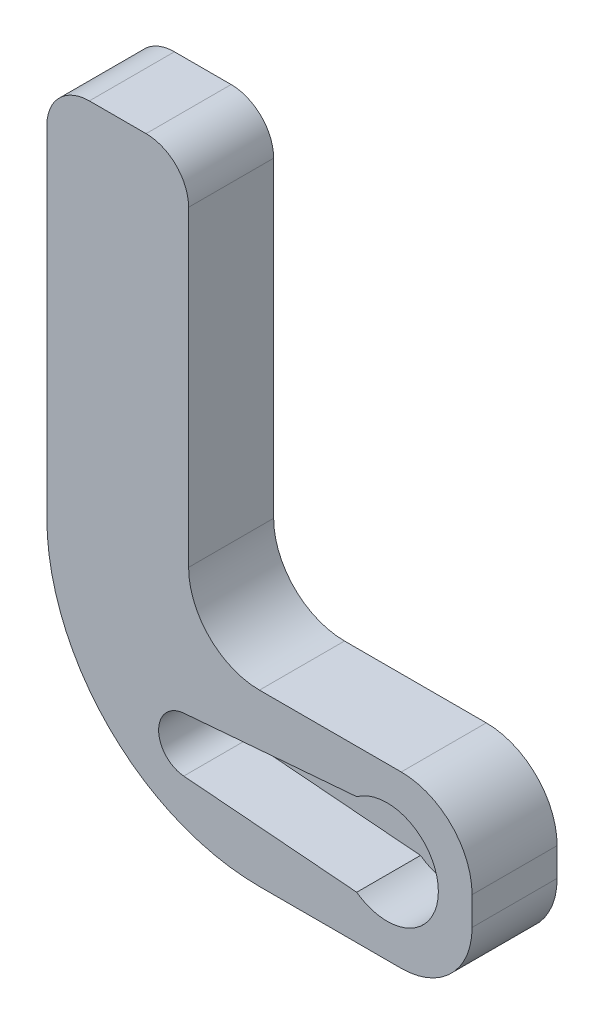
ISO-10303-21;
HEADER;
FILE_DESCRIPTION(('STEP AP214'),'2;1');
FILE_NAME('part.step','',(''),(''),'','','');
FILE_SCHEMA(('AUTOMOTIVE_DESIGN { 1 0 10303 214 1 1 1 1 }'));
ENDSEC;
DATA;
#1=APPLICATION_CONTEXT('core data for automotive mechanical design processes');
#2=APPLICATION_PROTOCOL_DEFINITION('international standard','automotive_design',2000,#1);
#3=PRODUCT_CONTEXT('',#1,'mechanical');
#4=PRODUCT('Part','Part','',(#3));
#5=PRODUCT_RELATED_PRODUCT_CATEGORY('part','',(#4));
#6=PRODUCT_DEFINITION_FORMATION('','',#4);
#7=PRODUCT_DEFINITION_CONTEXT('part definition',#1,'design');
#8=PRODUCT_DEFINITION('design','',#6,#7);
#9=PRODUCT_DEFINITION_SHAPE('','',#8);
#10=(LENGTH_UNIT() NAMED_UNIT(*) SI_UNIT(.MILLI.,.METRE.));
#11=(NAMED_UNIT(*) PLANE_ANGLE_UNIT() SI_UNIT($,.RADIAN.));
#12=(NAMED_UNIT(*) SI_UNIT($,.STERADIAN.) SOLID_ANGLE_UNIT());
#13=UNCERTAINTY_MEASURE_WITH_UNIT(LENGTH_MEASURE(1.E-05),#10,'distance_accuracy_value','');
#14=(GEOMETRIC_REPRESENTATION_CONTEXT(3) GLOBAL_UNCERTAINTY_ASSIGNED_CONTEXT((#13)) GLOBAL_UNIT_ASSIGNED_CONTEXT((#10,
#11,#12)) REPRESENTATION_CONTEXT('',''));
#15=CARTESIAN_POINT('',(0.,0.,0.));
#16=DIRECTION('',(0.,0.,1.));
#17=DIRECTION('',(1.,0.,0.));
#18=AXIS2_PLACEMENT_3D('',#15,#16,#17);
#19=CARTESIAN_POINT('',(-14.,36.,-6.));
#20=DIRECTION('',(0.,1.,0.));
#21=DIRECTION('',(0.,0.,1.));
#22=AXIS2_PLACEMENT_3D('',#19,#20,#21);
#23=PLANE('',#22);
#24=DIRECTION('',(-1.,0.,0.));
#25=VECTOR('',#24,1.);
#26=CARTESIAN_POINT('',(-14.,36.,-6.));
#27=LINE('',#26,#25);
#28=CARTESIAN_POINT('',(-17.,36.,-6.));
#29=VERTEX_POINT('',#28);
#30=CARTESIAN_POINT('',(-21.,36.,-6.));
#31=VERTEX_POINT('',#30);
#32=EDGE_CURVE('E210',#29,#31,#27,.T.);
#33=ORIENTED_EDGE('',*,*,#32,.T.);
#34=DIRECTION('',(0.,0.,1.));
#35=VECTOR('',#34,1.);
#36=CARTESIAN_POINT('',(-21.,36.,-6.));
#37=LINE('',#36,#35);
#38=CARTESIAN_POINT('',(-21.,36.,0.));
#39=VERTEX_POINT('',#38);
#40=EDGE_CURVE('E317',#31,#39,#37,.T.);
#41=ORIENTED_EDGE('',*,*,#40,.T.);
#42=DIRECTION('',(-1.,0.,0.));
#43=VECTOR('',#42,1.);
#44=CARTESIAN_POINT('',(-14.,36.,0.));
#45=LINE('',#44,#43);
#46=CARTESIAN_POINT('',(-17.,36.,0.));
#47=VERTEX_POINT('',#46);
#48=EDGE_CURVE('E201',#47,#39,#45,.T.);
#49=ORIENTED_EDGE('',*,*,#48,.F.);
#50=DIRECTION('',(0.,0.,1.));
#51=VECTOR('',#50,1.);
#52=CARTESIAN_POINT('',(-17.,36.,-6.));
#53=LINE('',#52,#51);
#54=EDGE_CURVE('E311',#47,#29,#53,.F.);
#55=ORIENTED_EDGE('',*,*,#54,.T.);
#56=EDGE_LOOP('',(#33,#41,#49,#55));
#57=FACE_BOUND('',#56,.T.);
#58=ADVANCED_FACE('F39',(#57),#23,.T.);
#59=CARTESIAN_POINT('',(-14.,5.99999999999999,-6.));
#60=DIRECTION('',(1.,0.,0.));
#61=DIRECTION('',(0.,1.,0.));
#62=AXIS2_PLACEMENT_3D('',#59,#60,#61);
#63=PLANE('',#62);
#64=DIRECTION('',(0.,1.,0.));
#65=VECTOR('',#64,1.);
#66=CARTESIAN_POINT('',(-14.,5.99999999999999,-6.));
#67=LINE('',#66,#65);
#68=CARTESIAN_POINT('',(-14.,11.,-6.));
#69=VERTEX_POINT('',#68);
#70=CARTESIAN_POINT('',(-14.,33.,-6.));
#71=VERTEX_POINT('',#70);
#72=EDGE_CURVE('E215',#69,#71,#67,.T.);
#73=ORIENTED_EDGE('',*,*,#72,.T.);
#74=DIRECTION('',(0.,0.,1.));
#75=VECTOR('',#74,1.);
#76=CARTESIAN_POINT('',(-14.,33.,-6.));
#77=LINE('',#76,#75);
#78=CARTESIAN_POINT('',(-14.,33.,0.));
#79=VERTEX_POINT('',#78);
#80=EDGE_CURVE('E304',#71,#79,#77,.T.);
#81=ORIENTED_EDGE('',*,*,#80,.T.);
#82=DIRECTION('',(0.,1.,0.));
#83=VECTOR('',#82,1.);
#84=CARTESIAN_POINT('',(-14.,5.99999999999999,0.));
#85=LINE('',#84,#83);
#86=CARTESIAN_POINT('',(-14.,11.,0.));
#87=VERTEX_POINT('',#86);
#88=EDGE_CURVE('E235',#87,#79,#85,.T.);
#89=ORIENTED_EDGE('',*,*,#88,.F.);
#90=DIRECTION('',(0.,0.,1.));
#91=VECTOR('',#90,1.);
#92=CARTESIAN_POINT('',(-14.,11.,-6.));
#93=LINE('',#92,#91);
#94=EDGE_CURVE('E256',#87,#69,#93,.F.);
#95=ORIENTED_EDGE('',*,*,#94,.T.);
#96=EDGE_LOOP('',(#73,#81,#89,#95));
#97=FACE_BOUND('',#96,.T.);
#98=ADVANCED_FACE('F345',(#97),#63,.T.);
#99=CARTESIAN_POINT('',(-14.,5.99999999999999,-6.));
#100=DIRECTION('',(0.,-1.,0.));
#101=DIRECTION('',(1.,0.,0.));
#102=AXIS2_PLACEMENT_3D('',#99,#100,#101);
#103=PLANE('',#102);
#104=DIRECTION('',(1.,0.,0.));
#105=VECTOR('',#104,1.);
#106=CARTESIAN_POINT('',(-14.,5.99999999999999,0.));
#107=LINE('',#106,#105);
#108=CARTESIAN_POINT('',(-9.,6.,0.));
#109=VERTEX_POINT('',#108);
#110=CARTESIAN_POINT('',(0.999999999999996,6.,0.));
#111=VERTEX_POINT('',#110);
#112=EDGE_CURVE('E239',#109,#111,#107,.T.);
#113=ORIENTED_EDGE('',*,*,#112,.T.);
#114=DIRECTION('',(0.,0.,1.));
#115=VECTOR('',#114,1.);
#116=CARTESIAN_POINT('',(0.999999999999996,6.,-6.));
#117=LINE('',#116,#115);
#118=CARTESIAN_POINT('',(0.999999999999996,6.,-6.));
#119=VERTEX_POINT('',#118);
#120=EDGE_CURVE('E285',#111,#119,#117,.F.);
#121=ORIENTED_EDGE('',*,*,#120,.T.);
#122=DIRECTION('',(1.,0.,0.));
#123=VECTOR('',#122,1.);
#124=CARTESIAN_POINT('',(-14.,5.99999999999999,-6.));
#125=LINE('',#124,#123);
#126=CARTESIAN_POINT('',(-9.,6.,-6.));
#127=VERTEX_POINT('',#126);
#128=EDGE_CURVE('E219',#127,#119,#125,.T.);
#129=ORIENTED_EDGE('',*,*,#128,.F.);
#130=DIRECTION('',(0.,0.,1.));
#131=VECTOR('',#130,1.);
#132=CARTESIAN_POINT('',(-9.,6.,-6.));
#133=LINE('',#132,#131);
#134=EDGE_CURVE('E231',#127,#109,#133,.T.);
#135=ORIENTED_EDGE('',*,*,#134,.T.);
#136=EDGE_LOOP('',(#113,#121,#129,#135));
#137=FACE_BOUND('',#136,.T.);
#138=ADVANCED_FACE('F354',(#137),#103,.F.);
#139=CARTESIAN_POINT('',(6.,6.,-6.));
#140=DIRECTION('',(-1.,0.,0.));
#141=DIRECTION('',(0.,-1.,0.));
#142=AXIS2_PLACEMENT_3D('',#139,#140,#141);
#143=PLANE('',#142);
#144=DIRECTION('',(0.,-1.,0.));
#145=VECTOR('',#144,1.);
#146=CARTESIAN_POINT('',(6.,6.,0.));
#147=LINE('',#146,#145);
#148=CARTESIAN_POINT('',(6.,0.999999999999999,0.));
#149=VERTEX_POINT('',#148);
#150=CARTESIAN_POINT('',(6.,-0.999999999999999,0.));
#151=VERTEX_POINT('',#150);
#152=EDGE_CURVE('E243',#149,#151,#147,.T.);
#153=ORIENTED_EDGE('',*,*,#152,.T.);
#154=DIRECTION('',(0.,0.,1.));
#155=VECTOR('',#154,1.);
#156=CARTESIAN_POINT('',(6.,-1.,-6.));
#157=LINE('',#156,#155);
#158=CARTESIAN_POINT('',(6.,-0.999999999999999,-6.));
#159=VERTEX_POINT('',#158);
#160=EDGE_CURVE('E298',#151,#159,#157,.F.);
#161=ORIENTED_EDGE('',*,*,#160,.T.);
#162=DIRECTION('',(0.,-1.,0.));
#163=VECTOR('',#162,1.);
#164=CARTESIAN_POINT('',(6.,6.,-6.));
#165=LINE('',#164,#163);
#166=CARTESIAN_POINT('',(6.,0.999999999999999,-6.));
#167=VERTEX_POINT('',#166);
#168=EDGE_CURVE('E223',#167,#159,#165,.T.);
#169=ORIENTED_EDGE('',*,*,#168,.F.);
#170=DIRECTION('',(0.,0.,1.));
#171=VECTOR('',#170,1.);
#172=CARTESIAN_POINT('',(6.,0.999999999999999,-6.));
#173=LINE('',#172,#171);
#174=EDGE_CURVE('E278',#167,#149,#173,.T.);
#175=ORIENTED_EDGE('',*,*,#174,.T.);
#176=EDGE_LOOP('',(#153,#161,#169,#175));
#177=FACE_BOUND('',#176,.T.);
#178=ADVANCED_FACE('F363',(#177),#143,.F.);
#179=CARTESIAN_POINT('',(-24.,-6.,-6.));
#180=DIRECTION('',(0.,-1.,0.));
#181=DIRECTION('',(1.,0.,0.));
#182=AXIS2_PLACEMENT_3D('',#179,#180,#181);
#183=PLANE('',#182);
#184=DIRECTION('',(1.,0.,0.));
#185=VECTOR('',#184,1.);
#186=CARTESIAN_POINT('',(-24.,-6.,-6.));
#187=LINE('',#186,#185);
#188=CARTESIAN_POINT('',(-9.,-6.,-6.));
#189=VERTEX_POINT('',#188);
#190=CARTESIAN_POINT('',(0.999999999999997,-6.,-6.));
#191=VERTEX_POINT('',#190);
#192=EDGE_CURVE('E227',#189,#191,#187,.T.);
#193=ORIENTED_EDGE('',*,*,#192,.T.);
#194=DIRECTION('',(0.,0.,1.));
#195=VECTOR('',#194,1.);
#196=CARTESIAN_POINT('',(0.999999999999998,-6.,0.));
#197=LINE('',#196,#195);
#198=CARTESIAN_POINT('',(0.999999999999997,-6.,0.));
#199=VERTEX_POINT('',#198);
#200=EDGE_CURVE('E291',#191,#199,#197,.T.);
#201=ORIENTED_EDGE('',*,*,#200,.T.);
#202=DIRECTION('',(1.,0.,0.));
#203=VECTOR('',#202,1.);
#204=CARTESIAN_POINT('',(-24.,-6.,0.));
#205=LINE('',#204,#203);
#206=CARTESIAN_POINT('',(-9.,-6.,0.));
#207=VERTEX_POINT('',#206);
#208=EDGE_CURVE('E247',#207,#199,#205,.T.);
#209=ORIENTED_EDGE('',*,*,#208,.F.);
#210=DIRECTION('',(0.,0.,1.));
#211=VECTOR('',#210,1.);
#212=CARTESIAN_POINT('',(-9.,-6.,-6.));
#213=LINE('',#212,#211);
#214=EDGE_CURVE('E272',#207,#189,#213,.F.);
#215=ORIENTED_EDGE('',*,*,#214,.T.);
#216=EDGE_LOOP('',(#193,#201,#209,#215));
#217=FACE_BOUND('',#216,.T.);
#218=ADVANCED_FACE('F372',(#217),#183,.T.);
#219=CARTESIAN_POINT('',(-24.,5.99999999999999,-6.));
#220=DIRECTION('',(-1.,0.,0.));
#221=DIRECTION('',(0.,0.,1.));
#222=AXIS2_PLACEMENT_3D('',#219,#220,#221);
#223=PLANE('',#222);
#224=DIRECTION('',(0.,-1.,0.));
#225=VECTOR('',#224,1.);
#226=CARTESIAN_POINT('',(-24.,5.99999999999999,0.));
#227=LINE('',#226,#225);
#228=CARTESIAN_POINT('',(-24.,33.,0.));
#229=VERTEX_POINT('',#228);
#230=CARTESIAN_POINT('',(-24.,9.,0.));
#231=VERTEX_POINT('',#230);
#232=EDGE_CURVE('E211',#229,#231,#227,.T.);
#233=ORIENTED_EDGE('',*,*,#232,.F.);
#234=DIRECTION('',(0.,0.,1.));
#235=VECTOR('',#234,1.);
#236=CARTESIAN_POINT('',(-24.,33.,-6.));
#237=LINE('',#236,#235);
#238=CARTESIAN_POINT('',(-24.,33.,-6.));
#239=VERTEX_POINT('',#238);
#240=EDGE_CURVE('E48',#229,#239,#237,.F.);
#241=ORIENTED_EDGE('',*,*,#240,.T.);
#242=DIRECTION('',(0.,1.,0.));
#243=VECTOR('',#242,1.);
#244=CARTESIAN_POINT('',(-24.,5.99999999999999,-6.));
#245=LINE('',#244,#243);
#246=CARTESIAN_POINT('',(-24.,9.,-6.));
#247=VERTEX_POINT('',#246);
#248=EDGE_CURVE('E207',#247,#239,#245,.T.);
#249=ORIENTED_EDGE('',*,*,#248,.F.);
#250=DIRECTION('',(0.,0.,1.));
#251=VECTOR('',#250,1.);
#252=CARTESIAN_POINT('',(-24.,9.,-6.));
#253=LINE('',#252,#251);
#254=EDGE_CURVE('E265',#247,#231,#253,.T.);
#255=ORIENTED_EDGE('',*,*,#254,.T.);
#256=EDGE_LOOP('',(#233,#241,#249,#255));
#257=FACE_BOUND('',#256,.T.);
#258=ADVANCED_FACE('F330',(#257),#223,.T.);
#259=CARTESIAN_POINT('',(0.,0.,-6.));
#260=DIRECTION('',(0.,0.,1.));
#261=DIRECTION('',(1.,0.,0.));
#262=AXIS2_PLACEMENT_3D('',#259,#260,#261);
#263=PLANE('',#262);
#264=CARTESIAN_POINT('',(0.,0.,-6.));
#265=DIRECTION('',(0.,0.,1.));
#266=DIRECTION('',(1.,0.,0.));
#267=AXIS2_PLACEMENT_3D('',#264,#265,#266);
#268=CIRCLE('',#267,1.5);
#269=CARTESIAN_POINT('',(1.5,0.,-6.));
#270=VERTEX_POINT('',#269);
#271=EDGE_CURVE('E183',#270,#270,#268,.T.);
#272=ORIENTED_EDGE('',*,*,#271,.T.);
#273=EDGE_LOOP('',(#272));
#274=FACE_BOUND('',#273,.T.);
#275=ORIENTED_EDGE('',*,*,#248,.T.);
#276=CARTESIAN_POINT('',(-21.,33.,-6.));
#277=DIRECTION('',(0.,0.,1.));
#278=DIRECTION('',(1.,0.,0.));
#279=AXIS2_PLACEMENT_3D('',#276,#277,#278);
#280=CIRCLE('',#279,3.);
#281=EDGE_CURVE('E11',#239,#31,#280,.F.);
#282=ORIENTED_EDGE('',*,*,#281,.T.);
#283=ORIENTED_EDGE('',*,*,#32,.F.);
#284=CARTESIAN_POINT('',(-17.,33.,-6.));
#285=DIRECTION('',(0.,0.,1.));
#286=DIRECTION('',(1.,0.,0.));
#287=AXIS2_PLACEMENT_3D('',#284,#285,#286);
#288=CIRCLE('',#287,3.);
#289=EDGE_CURVE('E314',#29,#71,#288,.F.);
#290=ORIENTED_EDGE('',*,*,#289,.T.);
#291=ORIENTED_EDGE('',*,*,#72,.F.);
#292=CARTESIAN_POINT('',(-9.,11.,-6.));
#293=DIRECTION('',(0.,0.,1.));
#294=DIRECTION('',(1.,0.,0.));
#295=AXIS2_PLACEMENT_3D('',#292,#293,#294);
#296=CIRCLE('',#295,5.);
#297=EDGE_CURVE('E262',#69,#127,#296,.T.);
#298=ORIENTED_EDGE('',*,*,#297,.T.);
#299=ORIENTED_EDGE('',*,*,#128,.T.);
#300=CARTESIAN_POINT('',(0.999999999999997,0.999999999999998,-6.));
#301=DIRECTION('',(0.,0.,1.));
#302=DIRECTION('',(1.,0.,0.));
#303=AXIS2_PLACEMENT_3D('',#300,#301,#302);
#304=CIRCLE('',#303,5.);
#305=EDGE_CURVE('E288',#119,#167,#304,.F.);
#306=ORIENTED_EDGE('',*,*,#305,.T.);
#307=ORIENTED_EDGE('',*,*,#168,.T.);
#308=CARTESIAN_POINT('',(0.999999999999997,-1.,-6.));
#309=DIRECTION('',(0.,0.,1.));
#310=DIRECTION('',(1.,0.,0.));
#311=AXIS2_PLACEMENT_3D('',#308,#309,#310);
#312=CIRCLE('',#311,5.);
#313=EDGE_CURVE('E301',#159,#191,#312,.F.);
#314=ORIENTED_EDGE('',*,*,#313,.T.);
#315=ORIENTED_EDGE('',*,*,#192,.F.);
#316=CARTESIAN_POINT('',(-9.,9.,-6.));
#317=DIRECTION('',(0.,0.,1.));
#318=DIRECTION('',(1.,0.,0.));
#319=AXIS2_PLACEMENT_3D('',#316,#317,#318);
#320=CIRCLE('',#319,15.);
#321=EDGE_CURVE('E275',#189,#247,#320,.F.);
#322=ORIENTED_EDGE('',*,*,#321,.T.);
#323=EDGE_LOOP('',(#275,#282,#283,#290,#291,#298,#299,#306,#307,#314,#315,#322));
#324=FACE_BOUND('',#323,.T.);
#325=ADVANCED_FACE('F335',(#274,#324),#263,.F.);
#326=CARTESIAN_POINT('',(0.,0.,0.));
#327=DIRECTION('',(0.,0.,1.));
#328=DIRECTION('',(1.,0.,0.));
#329=AXIS2_PLACEMENT_3D('',#326,#327,#328);
#330=PLANE('',#329);
#331=CARTESIAN_POINT('',(-14.186,0.,0.));
#332=DIRECTION('',(0.,0.,1.));
#333=DIRECTION('',(1.,0.,0.));
#334=AXIS2_PLACEMENT_3D('',#331,#332,#333);
#335=CIRCLE('',#334,1.93);
#336=CARTESIAN_POINT('',(-14.3430603968281,1.92359871900254,0.));
#337=VERTEX_POINT('',#336);
#338=CARTESIAN_POINT('',(-14.3430603968281,-1.92359871900254,0.));
#339=VERTEX_POINT('',#338);
#340=EDGE_CURVE('E55',#337,#339,#335,.T.);
#341=ORIENTED_EDGE('',*,*,#340,.F.);
#342=DIRECTION('',(-0.996683274094579,-0.0813784439523775,0.));
#343=VECTOR('',#342,1.);
#344=CARTESIAN_POINT('',(-14.3430603968281,1.92359871900254,0.));
#345=LINE('',#344,#343);
#346=CARTESIAN_POINT('',(-2.13962613556668,2.92,0.));
#347=VERTEX_POINT('',#346);
#348=EDGE_CURVE('E176',#347,#337,#345,.T.);
#349=ORIENTED_EDGE('',*,*,#348,.F.);
#350=CARTESIAN_POINT('',(0.,0.,0.));
#351=DIRECTION('',(0.,0.,1.));
#352=DIRECTION('',(1.,0.,0.));
#353=AXIS2_PLACEMENT_3D('',#350,#351,#352);
#354=CIRCLE('',#353,3.62);
#355=CARTESIAN_POINT('',(-2.13962613556668,-2.92,0.));
#356=VERTEX_POINT('',#355);
#357=EDGE_CURVE('E180',#356,#347,#354,.T.);
#358=ORIENTED_EDGE('',*,*,#357,.F.);
#359=DIRECTION('',(0.996683274094579,-0.0813784439523775,0.));
#360=VECTOR('',#359,1.);
#361=CARTESIAN_POINT('',(-14.3430603968281,-1.92359871900254,0.));
#362=LINE('',#361,#360);
#363=EDGE_CURVE('E192',#339,#356,#362,.T.);
#364=ORIENTED_EDGE('',*,*,#363,.F.);
#365=EDGE_LOOP('',(#341,#349,#358,#364));
#366=FACE_BOUND('',#365,.T.);
#367=ORIENTED_EDGE('',*,*,#48,.T.);
#368=CARTESIAN_POINT('',(-21.,33.,0.));
#369=DIRECTION('',(0.,0.,1.));
#370=DIRECTION('',(1.,0.,0.));
#371=AXIS2_PLACEMENT_3D('',#368,#369,#370);
#372=CIRCLE('',#371,3.);
#373=EDGE_CURVE('E321',#39,#229,#372,.T.);
#374=ORIENTED_EDGE('',*,*,#373,.T.);
#375=ORIENTED_EDGE('',*,*,#232,.T.);
#376=CARTESIAN_POINT('',(-9.,9.,0.));
#377=DIRECTION('',(0.,0.,1.));
#378=DIRECTION('',(1.,0.,0.));
#379=AXIS2_PLACEMENT_3D('',#376,#377,#378);
#380=CIRCLE('',#379,15.);
#381=EDGE_CURVE('E269',#231,#207,#380,.T.);
#382=ORIENTED_EDGE('',*,*,#381,.T.);
#383=ORIENTED_EDGE('',*,*,#208,.T.);
#384=CARTESIAN_POINT('',(0.999999999999997,-1.,0.));
#385=DIRECTION('',(0.,0.,1.));
#386=DIRECTION('',(1.,0.,0.));
#387=AXIS2_PLACEMENT_3D('',#384,#385,#386);
#388=CIRCLE('',#387,5.);
#389=EDGE_CURVE('E295',#199,#151,#388,.T.);
#390=ORIENTED_EDGE('',*,*,#389,.T.);
#391=ORIENTED_EDGE('',*,*,#152,.F.);
#392=CARTESIAN_POINT('',(0.999999999999997,0.999999999999998,0.));
#393=DIRECTION('',(0.,0.,1.));
#394=DIRECTION('',(1.,0.,0.));
#395=AXIS2_PLACEMENT_3D('',#392,#393,#394);
#396=CIRCLE('',#395,5.);
#397=EDGE_CURVE('E282',#149,#111,#396,.T.);
#398=ORIENTED_EDGE('',*,*,#397,.T.);
#399=ORIENTED_EDGE('',*,*,#112,.F.);
#400=CARTESIAN_POINT('',(-9.,11.,0.));
#401=DIRECTION('',(0.,0.,1.));
#402=DIRECTION('',(1.,0.,0.));
#403=AXIS2_PLACEMENT_3D('',#400,#401,#402);
#404=CIRCLE('',#403,5.);
#405=EDGE_CURVE('E259',#109,#87,#404,.F.);
#406=ORIENTED_EDGE('',*,*,#405,.T.);
#407=ORIENTED_EDGE('',*,*,#88,.T.);
#408=CARTESIAN_POINT('',(-17.,33.,0.));
#409=DIRECTION('',(0.,0.,1.));
#410=DIRECTION('',(1.,0.,0.));
#411=AXIS2_PLACEMENT_3D('',#408,#409,#410);
#412=CIRCLE('',#411,3.);
#413=EDGE_CURVE('E308',#79,#47,#412,.T.);
#414=ORIENTED_EDGE('',*,*,#413,.T.);
#415=EDGE_LOOP('',(#367,#374,#375,#382,#383,#390,#391,#398,#399,#406,#407,#414));
#416=FACE_BOUND('',#415,.T.);
#417=ADVANCED_FACE('F325',(#366,#416),#330,.T.);
#418=CARTESIAN_POINT('',(-9.,11.,-6.));
#419=DIRECTION('',(0.,0.,1.));
#420=DIRECTION('',(1.,0.,0.));
#421=AXIS2_PLACEMENT_3D('',#418,#419,#420);
#422=CYLINDRICAL_SURFACE('',#421,5.);
#423=ORIENTED_EDGE('',*,*,#297,.F.);
#424=ORIENTED_EDGE('',*,*,#94,.F.);
#425=ORIENTED_EDGE('',*,*,#405,.F.);
#426=ORIENTED_EDGE('',*,*,#134,.F.);
#427=EDGE_LOOP('',(#423,#424,#425,#426));
#428=FACE_BOUND('',#427,.T.);
#429=ADVANCED_FACE('F349',(#428),#422,.F.);
#430=CARTESIAN_POINT('',(-9.,9.,-6.));
#431=DIRECTION('',(0.,0.,1.));
#432=DIRECTION('',(1.,0.,0.));
#433=AXIS2_PLACEMENT_3D('',#430,#431,#432);
#434=CYLINDRICAL_SURFACE('',#433,15.);
#435=ORIENTED_EDGE('',*,*,#321,.F.);
#436=ORIENTED_EDGE('',*,*,#214,.F.);
#437=ORIENTED_EDGE('',*,*,#381,.F.);
#438=ORIENTED_EDGE('',*,*,#254,.F.);
#439=EDGE_LOOP('',(#435,#436,#437,#438));
#440=FACE_BOUND('',#439,.T.);
#441=ADVANCED_FACE('F376',(#440),#434,.T.);
#442=CARTESIAN_POINT('',(0.999999999999997,0.999999999999998,-6.));
#443=DIRECTION('',(0.,0.,1.));
#444=DIRECTION('',(1.,0.,0.));
#445=AXIS2_PLACEMENT_3D('',#442,#443,#444);
#446=CYLINDRICAL_SURFACE('',#445,5.);
#447=ORIENTED_EDGE('',*,*,#305,.F.);
#448=ORIENTED_EDGE('',*,*,#120,.F.);
#449=ORIENTED_EDGE('',*,*,#397,.F.);
#450=ORIENTED_EDGE('',*,*,#174,.F.);
#451=EDGE_LOOP('',(#447,#448,#449,#450));
#452=FACE_BOUND('',#451,.T.);
#453=ADVANCED_FACE('F358',(#452),#446,.T.);
#454=CARTESIAN_POINT('',(0.999999999999997,-1.,-6.));
#455=DIRECTION('',(0.,0.,-1.));
#456=DIRECTION('',(-1.,0.,0.));
#457=AXIS2_PLACEMENT_3D('',#454,#455,#456);
#458=CYLINDRICAL_SURFACE('',#457,5.);
#459=ORIENTED_EDGE('',*,*,#313,.F.);
#460=ORIENTED_EDGE('',*,*,#160,.F.);
#461=ORIENTED_EDGE('',*,*,#389,.F.);
#462=ORIENTED_EDGE('',*,*,#200,.F.);
#463=EDGE_LOOP('',(#459,#460,#461,#462));
#464=FACE_BOUND('',#463,.T.);
#465=ADVANCED_FACE('F367',(#464),#458,.T.);
#466=CARTESIAN_POINT('',(-17.,33.,-6.));
#467=DIRECTION('',(0.,0.,1.));
#468=DIRECTION('',(1.,0.,0.));
#469=AXIS2_PLACEMENT_3D('',#466,#467,#468);
#470=CYLINDRICAL_SURFACE('',#469,3.);
#471=ORIENTED_EDGE('',*,*,#289,.F.);
#472=ORIENTED_EDGE('',*,*,#54,.F.);
#473=ORIENTED_EDGE('',*,*,#413,.F.);
#474=ORIENTED_EDGE('',*,*,#80,.F.);
#475=EDGE_LOOP('',(#471,#472,#473,#474));
#476=FACE_BOUND('',#475,.T.);
#477=ADVANCED_FACE('F340',(#476),#470,.T.);
#478=CARTESIAN_POINT('',(-21.,33.,-6.));
#479=DIRECTION('',(0.,0.,1.));
#480=DIRECTION('',(1.,0.,0.));
#481=AXIS2_PLACEMENT_3D('',#478,#479,#480);
#482=CYLINDRICAL_SURFACE('',#481,3.);
#483=ORIENTED_EDGE('',*,*,#281,.F.);
#484=ORIENTED_EDGE('',*,*,#240,.F.);
#485=ORIENTED_EDGE('',*,*,#373,.F.);
#486=ORIENTED_EDGE('',*,*,#40,.F.);
#487=EDGE_LOOP('',(#483,#484,#485,#486));
#488=FACE_BOUND('',#487,.T.);
#489=ADVANCED_FACE('F41',(#488),#482,.T.);
#490=CARTESIAN_POINT('',(-14.186,0.,-4.5));
#491=DIRECTION('',(0.,0.,1.));
#492=DIRECTION('',(1.,0.,0.));
#493=AXIS2_PLACEMENT_3D('',#490,#491,#492);
#494=CYLINDRICAL_SURFACE('',#493,1.93);
#495=ORIENTED_EDGE('',*,*,#340,.T.);
#496=DIRECTION('',(0.,0.,1.));
#497=VECTOR('',#496,1.);
#498=CARTESIAN_POINT('',(-14.3430603968281,-1.92359871900254,-4.5));
#499=LINE('',#498,#497);
#500=CARTESIAN_POINT('',(-14.3430603968281,-1.92359871900254,-4.5));
#501=VERTEX_POINT('',#500);
#502=EDGE_CURVE('E151',#501,#339,#499,.T.);
#503=ORIENTED_EDGE('',*,*,#502,.F.);
#504=CARTESIAN_POINT('',(-14.186,0.,-4.5));
#505=DIRECTION('',(0.,0.,1.));
#506=DIRECTION('',(1.,0.,0.));
#507=AXIS2_PLACEMENT_3D('',#504,#505,#506);
#508=CIRCLE('',#507,1.93);
#509=CARTESIAN_POINT('',(-14.3430603968281,1.92359871900254,-4.5));
#510=VERTEX_POINT('',#509);
#511=EDGE_CURVE('E155',#510,#501,#508,.T.);
#512=ORIENTED_EDGE('',*,*,#511,.F.);
#513=DIRECTION('',(0.,0.,1.));
#514=VECTOR('',#513,1.);
#515=CARTESIAN_POINT('',(-14.3430603968281,1.92359871900254,-4.5));
#516=LINE('',#515,#514);
#517=EDGE_CURVE('E198',#510,#337,#516,.T.);
#518=ORIENTED_EDGE('',*,*,#517,.T.);
#519=EDGE_LOOP('',(#495,#503,#512,#518));
#520=FACE_BOUND('',#519,.T.);
#521=ADVANCED_FACE('F153',(#520),#494,.F.);
#522=CARTESIAN_POINT('',(-14.3430603968281,1.92359871900254,-4.5));
#523=DIRECTION('',(-0.0813784439523775,0.996683274094579,0.));
#524=DIRECTION('',(-0.996683274094579,-0.0813784439523775,0.));
#525=AXIS2_PLACEMENT_3D('',#522,#523,#524);
#526=PLANE('',#525);
#527=ORIENTED_EDGE('',*,*,#348,.T.);
#528=ORIENTED_EDGE('',*,*,#517,.F.);
#529=DIRECTION('',(-0.996683274094579,-0.0813784439523775,0.));
#530=VECTOR('',#529,1.);
#531=CARTESIAN_POINT('',(-14.3430603968281,1.92359871900254,-4.5));
#532=LINE('',#531,#530);
#533=CARTESIAN_POINT('',(-2.13962613556668,2.92,-4.5));
#534=VERTEX_POINT('',#533);
#535=EDGE_CURVE('E162',#534,#510,#532,.T.);
#536=ORIENTED_EDGE('',*,*,#535,.F.);
#537=DIRECTION('',(0.,0.,1.));
#538=VECTOR('',#537,1.);
#539=CARTESIAN_POINT('',(-2.13962613556668,2.92,-4.5));
#540=LINE('',#539,#538);
#541=EDGE_CURVE('E202',#534,#347,#540,.T.);
#542=ORIENTED_EDGE('',*,*,#541,.T.);
#543=EDGE_LOOP('',(#527,#528,#536,#542));
#544=FACE_BOUND('',#543,.T.);
#545=ADVANCED_FACE('F408',(#544),#526,.F.);
#546=CARTESIAN_POINT('',(0.,0.,-4.5));
#547=DIRECTION('',(0.,0.,1.));
#548=DIRECTION('',(1.,0.,0.));
#549=AXIS2_PLACEMENT_3D('',#546,#547,#548);
#550=CYLINDRICAL_SURFACE('',#549,3.62);
#551=ORIENTED_EDGE('',*,*,#357,.T.);
#552=ORIENTED_EDGE('',*,*,#541,.F.);
#553=CARTESIAN_POINT('',(0.,0.,-4.5));
#554=DIRECTION('',(0.,0.,1.));
#555=DIRECTION('',(1.,0.,0.));
#556=AXIS2_PLACEMENT_3D('',#553,#554,#555);
#557=CIRCLE('',#556,3.62);
#558=CARTESIAN_POINT('',(-2.13962613556668,-2.92,-4.5));
#559=VERTEX_POINT('',#558);
#560=EDGE_CURVE('E171',#559,#534,#557,.T.);
#561=ORIENTED_EDGE('',*,*,#560,.F.);
#562=DIRECTION('',(0.,0.,1.));
#563=VECTOR('',#562,1.);
#564=CARTESIAN_POINT('',(-2.13962613556668,-2.92,-4.5));
#565=LINE('',#564,#563);
#566=EDGE_CURVE('E161',#559,#356,#565,.T.);
#567=ORIENTED_EDGE('',*,*,#566,.T.);
#568=EDGE_LOOP('',(#551,#552,#561,#567));
#569=FACE_BOUND('',#568,.T.);
#570=ADVANCED_FACE('F411',(#569),#550,.F.);
#571=CARTESIAN_POINT('',(-14.3430603968281,-1.92359871900254,-4.5));
#572=DIRECTION('',(-0.0813784439523775,-0.996683274094579,0.));
#573=DIRECTION('',(0.996683274094579,-0.0813784439523775,0.));
#574=AXIS2_PLACEMENT_3D('',#571,#572,#573);
#575=PLANE('',#574);
#576=ORIENTED_EDGE('',*,*,#363,.T.);
#577=ORIENTED_EDGE('',*,*,#566,.F.);
#578=DIRECTION('',(0.996683274094579,-0.0813784439523775,0.));
#579=VECTOR('',#578,1.);
#580=CARTESIAN_POINT('',(-14.3430603968281,-1.92359871900254,-4.5));
#581=LINE('',#580,#579);
#582=EDGE_CURVE('E165',#501,#559,#581,.T.);
#583=ORIENTED_EDGE('',*,*,#582,.F.);
#584=ORIENTED_EDGE('',*,*,#502,.T.);
#585=EDGE_LOOP('',(#576,#577,#583,#584));
#586=FACE_BOUND('',#585,.T.);
#587=ADVANCED_FACE('F166',(#586),#575,.F.);
#588=CARTESIAN_POINT('',(-14.186,0.,-4.5));
#589=DIRECTION('',(0.,0.,1.));
#590=DIRECTION('',(1.,0.,0.));
#591=AXIS2_PLACEMENT_3D('',#588,#589,#590);
#592=PLANE('',#591);
#593=CARTESIAN_POINT('',(0.,0.,-4.5));
#594=DIRECTION('',(0.,0.,1.));
#595=DIRECTION('',(1.,0.,0.));
#596=AXIS2_PLACEMENT_3D('',#593,#594,#595);
#597=CIRCLE('',#596,1.5);
#598=CARTESIAN_POINT('',(1.5,0.,-4.5));
#599=VERTEX_POINT('',#598);
#600=EDGE_CURVE('E429',#599,#599,#597,.T.);
#601=ORIENTED_EDGE('',*,*,#600,.F.);
#602=EDGE_LOOP('',(#601));
#603=FACE_BOUND('',#602,.T.);
#604=ORIENTED_EDGE('',*,*,#511,.T.);
#605=ORIENTED_EDGE('',*,*,#582,.T.);
#606=ORIENTED_EDGE('',*,*,#560,.T.);
#607=ORIENTED_EDGE('',*,*,#535,.T.);
#608=EDGE_LOOP('',(#604,#605,#606,#607));
#609=FACE_BOUND('',#608,.T.);
#610=ADVANCED_FACE('F173',(#603,#609),#592,.T.);
#611=CARTESIAN_POINT('',(0.,0.,-9.5));
#612=DIRECTION('',(0.,0.,1.));
#613=DIRECTION('',(1.,0.,0.));
#614=AXIS2_PLACEMENT_3D('',#611,#612,#613);
#615=CYLINDRICAL_SURFACE('',#614,1.5);
#616=ORIENTED_EDGE('',*,*,#600,.T.);
#617=EDGE_LOOP('',(#616));
#618=FACE_BOUND('',#617,.T.);
#619=ORIENTED_EDGE('',*,*,#271,.F.);
#620=EDGE_LOOP('',(#619));
#621=FACE_BOUND('',#620,.T.);
#622=ADVANCED_FACE('F420',(#618,#621),#615,.F.);
#623=CLOSED_SHELL('',(#58,#98,#138,#178,#218,#258,#325,#417,#429,#441,#453,#465,#477,#489,#521,
#545,#570,#587,#610,#622));
#624=MANIFOLD_SOLID_BREP('B2',#623);
#625=ADVANCED_BREP_SHAPE_REPRESENTATION('',(#18,#624),#14);
#626=SHAPE_DEFINITION_REPRESENTATION(#9,#625);
ENDSEC;
END-ISO-10303-21;
